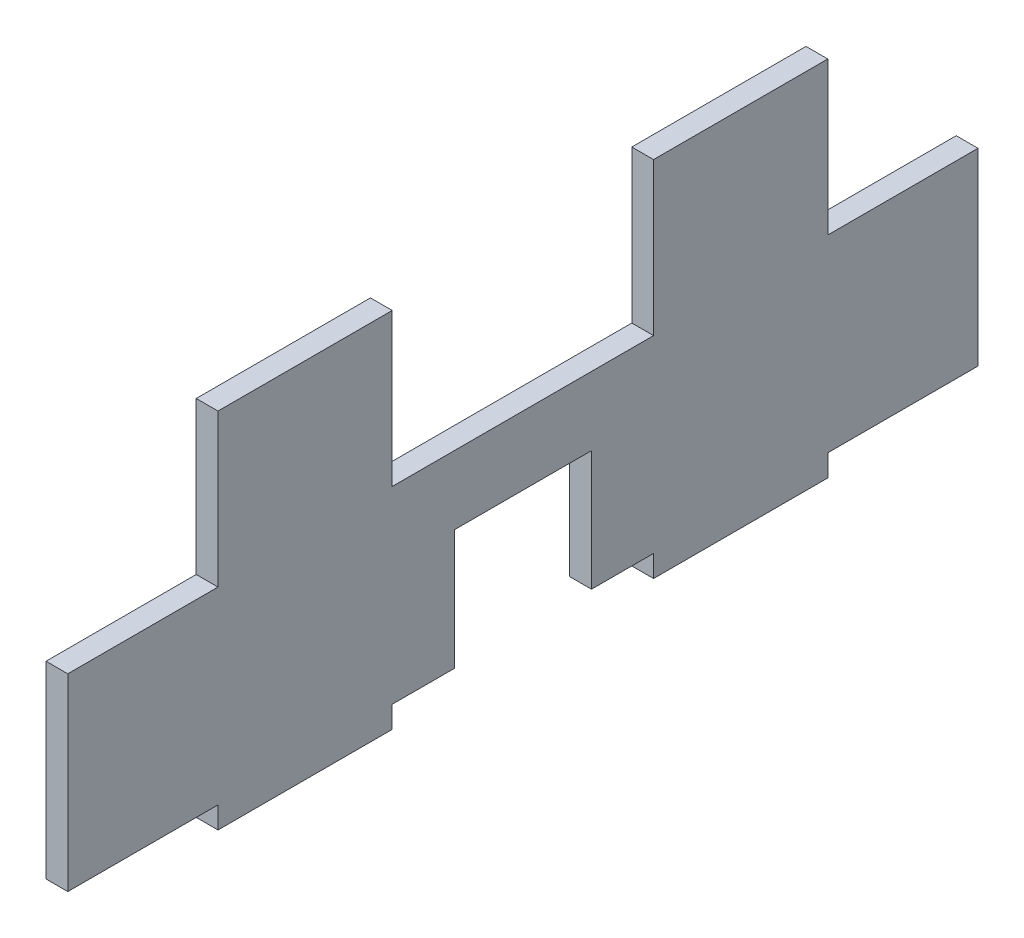
ISO-10303-21;
HEADER;
FILE_DESCRIPTION(('STEP AP214'),'2;1');
FILE_NAME('part.step','',(''),(''),'','','');
FILE_SCHEMA(('AUTOMOTIVE_DESIGN { 1 0 10303 214 1 1 1 1 }'));
ENDSEC;
DATA;
#1=APPLICATION_CONTEXT('core data for automotive mechanical design processes');
#2=APPLICATION_PROTOCOL_DEFINITION('international standard','automotive_design',2000,#1);
#3=PRODUCT_CONTEXT('',#1,'mechanical');
#4=PRODUCT('Part','Part','',(#3));
#5=PRODUCT_RELATED_PRODUCT_CATEGORY('part','',(#4));
#6=PRODUCT_DEFINITION_FORMATION('','',#4);
#7=PRODUCT_DEFINITION_CONTEXT('part definition',#1,'design');
#8=PRODUCT_DEFINITION('design','',#6,#7);
#9=PRODUCT_DEFINITION_SHAPE('','',#8);
#10=(LENGTH_UNIT() NAMED_UNIT(*) SI_UNIT(.MILLI.,.METRE.));
#11=(NAMED_UNIT(*) PLANE_ANGLE_UNIT() SI_UNIT($,.RADIAN.));
#12=(NAMED_UNIT(*) SI_UNIT($,.STERADIAN.) SOLID_ANGLE_UNIT());
#13=UNCERTAINTY_MEASURE_WITH_UNIT(LENGTH_MEASURE(1.E-05),#10,'distance_accuracy_value','');
#14=(GEOMETRIC_REPRESENTATION_CONTEXT(3) GLOBAL_UNCERTAINTY_ASSIGNED_CONTEXT((#13)) GLOBAL_UNIT_ASSIGNED_CONTEXT((#10,
#11,#12)) REPRESENTATION_CONTEXT('',''));
#15=CARTESIAN_POINT('',(0.,0.,0.));
#16=DIRECTION('',(0.,0.,1.));
#17=DIRECTION('',(1.,0.,0.));
#18=AXIS2_PLACEMENT_3D('',#15,#16,#17);
#19=CARTESIAN_POINT('',(6.35,0.,-20.));
#20=DIRECTION('',(0.,0.,1.));
#21=DIRECTION('',(1.,0.,0.));
#22=AXIS2_PLACEMENT_3D('',#19,#20,#21);
#23=PLANE('',#22);
#24=DIRECTION('',(0.,1.,0.));
#25=VECTOR('',#24,1.);
#26=CARTESIAN_POINT('',(0.,0.,-20.));
#27=LINE('',#26,#25);
#28=CARTESIAN_POINT('',(0.,0.,-20.));
#29=VERTEX_POINT('',#28);
#30=CARTESIAN_POINT('',(0.,35.,-20.));
#31=VERTEX_POINT('',#30);
#32=EDGE_CURVE('E430',#29,#31,#27,.T.);
#33=ORIENTED_EDGE('',*,*,#32,.F.);
#34=DIRECTION('',(1.,0.,0.));
#35=VECTOR('',#34,1.);
#36=CARTESIAN_POINT('',(0.,0.,-20.));
#37=LINE('',#36,#35);
#38=CARTESIAN_POINT('',(6.35,0.,-20.));
#39=VERTEX_POINT('',#38);
#40=EDGE_CURVE('E334',#29,#39,#37,.T.);
#41=ORIENTED_EDGE('',*,*,#40,.T.);
#42=DIRECTION('',(0.,1.,0.));
#43=VECTOR('',#42,1.);
#44=CARTESIAN_POINT('',(6.35,0.,-20.));
#45=LINE('',#44,#43);
#46=CARTESIAN_POINT('',(6.35,35.,-20.));
#47=VERTEX_POINT('',#46);
#48=EDGE_CURVE('E431',#39,#47,#45,.T.);
#49=ORIENTED_EDGE('',*,*,#48,.T.);
#50=DIRECTION('',(-1.,0.,0.));
#51=VECTOR('',#50,1.);
#52=CARTESIAN_POINT('',(6.35,35.,-20.));
#53=LINE('',#52,#51);
#54=EDGE_CURVE('E49',#47,#31,#53,.T.);
#55=ORIENTED_EDGE('',*,*,#54,.T.);
#56=EDGE_LOOP('',(#33,#41,#49,#55));
#57=FACE_BOUND('',#56,.T.);
#58=ADVANCED_FACE('F41',(#57),#23,.T.);
#59=CARTESIAN_POINT('',(6.35,0.,132.7));
#60=DIRECTION('',(0.,0.,1.));
#61=DIRECTION('',(1.,0.,0.));
#62=AXIS2_PLACEMENT_3D('',#59,#60,#61);
#63=PLANE('',#62);
#64=DIRECTION('',(1.,0.,0.));
#65=VECTOR('',#64,1.);
#66=CARTESIAN_POINT('',(0.,55.000000012,132.7));
#67=LINE('',#66,#65);
#68=CARTESIAN_POINT('',(0.,55.000000012,132.7));
#69=VERTEX_POINT('',#68);
#70=CARTESIAN_POINT('',(6.35,55.000000012,132.7));
#71=VERTEX_POINT('',#70);
#72=EDGE_CURVE('E286',#69,#71,#67,.T.);
#73=ORIENTED_EDGE('',*,*,#72,.F.);
#74=DIRECTION('',(0.,1.,0.));
#75=VECTOR('',#74,1.);
#76=CARTESIAN_POINT('',(0.,0.,132.7));
#77=LINE('',#76,#75);
#78=CARTESIAN_POINT('',(0.,0.,132.7));
#79=VERTEX_POINT('',#78);
#80=EDGE_CURVE('E448',#79,#69,#77,.T.);
#81=ORIENTED_EDGE('',*,*,#80,.F.);
#82=DIRECTION('',(1.,0.,0.));
#83=VECTOR('',#82,1.);
#84=CARTESIAN_POINT('',(0.,0.,132.7));
#85=LINE('',#84,#83);
#86=CARTESIAN_POINT('',(6.35,0.,132.7));
#87=VERTEX_POINT('',#86);
#88=EDGE_CURVE('E401',#79,#87,#85,.T.);
#89=ORIENTED_EDGE('',*,*,#88,.T.);
#90=DIRECTION('',(0.,1.,0.));
#91=VECTOR('',#90,1.);
#92=CARTESIAN_POINT('',(6.35,0.,132.7));
#93=LINE('',#92,#91);
#94=EDGE_CURVE('E434',#87,#71,#93,.T.);
#95=ORIENTED_EDGE('',*,*,#94,.T.);
#96=EDGE_LOOP('',(#73,#81,#89,#95));
#97=FACE_BOUND('',#96,.T.);
#98=ADVANCED_FACE('F504',(#97),#63,.T.);
#99=CARTESIAN_POINT('',(6.35,0.,20.));
#100=DIRECTION('',(0.,0.,1.));
#101=DIRECTION('',(1.,0.,0.));
#102=AXIS2_PLACEMENT_3D('',#99,#100,#101);
#103=PLANE('',#102);
#104=DIRECTION('',(1.,0.,0.));
#105=VECTOR('',#104,1.);
#106=CARTESIAN_POINT('',(0.,0.,20.));
#107=LINE('',#106,#105);
#108=CARTESIAN_POINT('',(0.,0.,20.));
#109=VERTEX_POINT('',#108);
#110=CARTESIAN_POINT('',(6.35,0.,20.));
#111=VERTEX_POINT('',#110);
#112=EDGE_CURVE('E308',#109,#111,#107,.T.);
#113=ORIENTED_EDGE('',*,*,#112,.F.);
#114=DIRECTION('',(0.,1.,0.));
#115=VECTOR('',#114,1.);
#116=CARTESIAN_POINT('',(0.,0.,20.));
#117=LINE('',#116,#115);
#118=CARTESIAN_POINT('',(0.,35.,20.));
#119=VERTEX_POINT('',#118);
#120=EDGE_CURVE('E452',#109,#119,#117,.T.);
#121=ORIENTED_EDGE('',*,*,#120,.T.);
#122=DIRECTION('',(-1.,0.,0.));
#123=VECTOR('',#122,1.);
#124=CARTESIAN_POINT('',(6.35,35.,20.));
#125=LINE('',#124,#123);
#126=CARTESIAN_POINT('',(6.35,35.,20.));
#127=VERTEX_POINT('',#126);
#128=EDGE_CURVE('E11',#127,#119,#125,.T.);
#129=ORIENTED_EDGE('',*,*,#128,.F.);
#130=DIRECTION('',(0.,1.,0.));
#131=VECTOR('',#130,1.);
#132=CARTESIAN_POINT('',(6.35,0.,20.));
#133=LINE('',#132,#131);
#134=EDGE_CURVE('E439',#111,#127,#133,.T.);
#135=ORIENTED_EDGE('',*,*,#134,.F.);
#136=EDGE_LOOP('',(#113,#121,#129,#135));
#137=FACE_BOUND('',#136,.T.);
#138=ADVANCED_FACE('F483',(#137),#103,.F.);
#139=CARTESIAN_POINT('',(6.35,0.,0.));
#140=DIRECTION('',(1.,0.,0.));
#141=DIRECTION('',(0.,0.,-1.));
#142=AXIS2_PLACEMENT_3D('',#139,#140,#141);
#143=PLANE('',#142);
#144=DIRECTION('',(0.,-1.,0.));
#145=VECTOR('',#144,1.);
#146=CARTESIAN_POINT('',(6.35,0.,38.1));
#147=LINE('',#146,#145);
#148=CARTESIAN_POINT('',(6.35,0.,38.1));
#149=VERTEX_POINT('',#148);
#150=CARTESIAN_POINT('',(6.35,-6.35,38.1));
#151=VERTEX_POINT('',#150);
#152=EDGE_CURVE('E64',#149,#151,#147,.T.);
#153=ORIENTED_EDGE('',*,*,#152,.F.);
#154=DIRECTION('',(0.,0.,-1.));
#155=VECTOR('',#154,1.);
#156=CARTESIAN_POINT('',(6.35,0.,0.));
#157=LINE('',#156,#155);
#158=EDGE_CURVE('E301',#149,#111,#157,.T.);
#159=ORIENTED_EDGE('',*,*,#158,.T.);
#160=ORIENTED_EDGE('',*,*,#134,.T.);
#161=DIRECTION('',(0.,0.,-1.));
#162=VECTOR('',#161,1.);
#163=CARTESIAN_POINT('',(6.35,35.,0.));
#164=LINE('',#163,#162);
#165=EDGE_CURVE('E442',#127,#47,#164,.T.);
#166=ORIENTED_EDGE('',*,*,#165,.T.);
#167=ORIENTED_EDGE('',*,*,#48,.F.);
#168=DIRECTION('',(0.,0.,-1.));
#169=VECTOR('',#168,1.);
#170=CARTESIAN_POINT('',(6.35,0.,0.));
#171=LINE('',#170,#169);
#172=CARTESIAN_POINT('',(6.35,0.,-38.1));
#173=VERTEX_POINT('',#172);
#174=EDGE_CURVE('E320',#39,#173,#171,.T.);
#175=ORIENTED_EDGE('',*,*,#174,.T.);
#176=DIRECTION('',(0.,-1.,0.));
#177=VECTOR('',#176,1.);
#178=CARTESIAN_POINT('',(6.35,0.,-38.1));
#179=LINE('',#178,#177);
#180=CARTESIAN_POINT('',(6.35,-6.35,-38.1));
#181=VERTEX_POINT('',#180);
#182=EDGE_CURVE('E324',#173,#181,#179,.T.);
#183=ORIENTED_EDGE('',*,*,#182,.T.);
#184=DIRECTION('',(0.,0.,1.));
#185=VECTOR('',#184,1.);
#186=CARTESIAN_POINT('',(6.35,-6.35,-257.700000096));
#187=LINE('',#186,#185);
#188=CARTESIAN_POINT('',(6.35,-6.35,-88.9));
#189=VERTEX_POINT('',#188);
#190=EDGE_CURVE('E426',#189,#181,#187,.T.);
#191=ORIENTED_EDGE('',*,*,#190,.F.);
#192=DIRECTION('',(0.,-1.,0.));
#193=VECTOR('',#192,1.);
#194=CARTESIAN_POINT('',(6.35,0.,-88.9));
#195=LINE('',#194,#193);
#196=CARTESIAN_POINT('',(6.35,0.,-88.9));
#197=VERTEX_POINT('',#196);
#198=EDGE_CURVE('E344',#197,#189,#195,.T.);
#199=ORIENTED_EDGE('',*,*,#198,.F.);
#200=DIRECTION('',(0.,0.,-1.));
#201=VECTOR('',#200,1.);
#202=CARTESIAN_POINT('',(6.35,0.,0.));
#203=LINE('',#202,#201);
#204=CARTESIAN_POINT('',(6.35,0.,-132.7));
#205=VERTEX_POINT('',#204);
#206=EDGE_CURVE('E349',#197,#205,#203,.T.);
#207=ORIENTED_EDGE('',*,*,#206,.T.);
#208=DIRECTION('',(0.,-1.,0.));
#209=VECTOR('',#208,1.);
#210=CARTESIAN_POINT('',(6.35,61.350000012,-132.7));
#211=LINE('',#210,#209);
#212=CARTESIAN_POINT('',(6.35,55.000000012,-132.7));
#213=VERTEX_POINT('',#212);
#214=EDGE_CURVE('E400',#213,#205,#211,.T.);
#215=ORIENTED_EDGE('',*,*,#214,.F.);
#216=DIRECTION('',(0.,0.,1.));
#217=VECTOR('',#216,1.);
#218=CARTESIAN_POINT('',(6.35,55.000000012,0.));
#219=LINE('',#218,#217);
#220=CARTESIAN_POINT('',(6.35,55.000000012,-88.9));
#221=VERTEX_POINT('',#220);
#222=EDGE_CURVE('E277',#213,#221,#219,.T.);
#223=ORIENTED_EDGE('',*,*,#222,.T.);
#224=DIRECTION('',(0.,1.,0.));
#225=VECTOR('',#224,1.);
#226=CARTESIAN_POINT('',(6.35,0.,-88.9));
#227=LINE('',#226,#225);
#228=CARTESIAN_POINT('',(6.35,99.450000012,-88.9));
#229=VERTEX_POINT('',#228);
#230=EDGE_CURVE('E368',#221,#229,#227,.T.);
#231=ORIENTED_EDGE('',*,*,#230,.T.);
#232=DIRECTION('',(0.,0.,-1.));
#233=VECTOR('',#232,1.);
#234=CARTESIAN_POINT('',(6.35,99.450000012,-38.1));
#235=LINE('',#234,#233);
#236=CARTESIAN_POINT('',(6.35,99.450000012,-38.1));
#237=VERTEX_POINT('',#236);
#238=EDGE_CURVE('E244',#237,#229,#235,.T.);
#239=ORIENTED_EDGE('',*,*,#238,.F.);
#240=DIRECTION('',(0.,1.,0.));
#241=VECTOR('',#240,1.);
#242=CARTESIAN_POINT('',(6.35,0.,-38.1));
#243=LINE('',#242,#241);
#244=CARTESIAN_POINT('',(6.35,55.000000012,-38.1));
#245=VERTEX_POINT('',#244);
#246=EDGE_CURVE('E260',#245,#237,#243,.T.);
#247=ORIENTED_EDGE('',*,*,#246,.F.);
#248=DIRECTION('',(0.,0.,1.));
#249=VECTOR('',#248,1.);
#250=CARTESIAN_POINT('',(6.35,55.000000012,0.));
#251=LINE('',#250,#249);
#252=CARTESIAN_POINT('',(6.35,55.000000012,38.1));
#253=VERTEX_POINT('',#252);
#254=EDGE_CURVE('E269',#245,#253,#251,.T.);
#255=ORIENTED_EDGE('',*,*,#254,.T.);
#256=DIRECTION('',(0.,1.,0.));
#257=VECTOR('',#256,1.);
#258=CARTESIAN_POINT('',(6.35,0.,38.1));
#259=LINE('',#258,#257);
#260=CARTESIAN_POINT('',(6.35,99.450000012,38.1));
#261=VERTEX_POINT('',#260);
#262=EDGE_CURVE('E222',#253,#261,#259,.T.);
#263=ORIENTED_EDGE('',*,*,#262,.T.);
#264=DIRECTION('',(0.,0.,-1.));
#265=VECTOR('',#264,1.);
#266=CARTESIAN_POINT('',(6.35,99.450000012,88.9));
#267=LINE('',#266,#265);
#268=CARTESIAN_POINT('',(6.35,99.450000012,88.9));
#269=VERTEX_POINT('',#268);
#270=EDGE_CURVE('E218',#269,#261,#267,.T.);
#271=ORIENTED_EDGE('',*,*,#270,.F.);
#272=DIRECTION('',(0.,1.,0.));
#273=VECTOR('',#272,1.);
#274=CARTESIAN_POINT('',(6.35,0.,88.9));
#275=LINE('',#274,#273);
#276=CARTESIAN_POINT('',(6.35,55.000000012,88.9));
#277=VERTEX_POINT('',#276);
#278=EDGE_CURVE('E203',#277,#269,#275,.T.);
#279=ORIENTED_EDGE('',*,*,#278,.F.);
#280=DIRECTION('',(0.,0.,-1.));
#281=VECTOR('',#280,1.);
#282=CARTESIAN_POINT('',(6.35,55.000000012,0.));
#283=LINE('',#282,#281);
#284=EDGE_CURVE('E215',#71,#277,#283,.T.);
#285=ORIENTED_EDGE('',*,*,#284,.F.);
#286=ORIENTED_EDGE('',*,*,#94,.F.);
#287=DIRECTION('',(0.,0.,-1.));
#288=VECTOR('',#287,1.);
#289=CARTESIAN_POINT('',(6.35,0.,0.));
#290=LINE('',#289,#288);
#291=CARTESIAN_POINT('',(6.35,0.,88.9));
#292=VERTEX_POINT('',#291);
#293=EDGE_CURVE('E387',#87,#292,#290,.T.);
#294=ORIENTED_EDGE('',*,*,#293,.T.);
#295=DIRECTION('',(0.,-1.,0.));
#296=VECTOR('',#295,1.);
#297=CARTESIAN_POINT('',(6.35,0.,88.9));
#298=LINE('',#297,#296);
#299=CARTESIAN_POINT('',(6.35,-6.35,88.9));
#300=VERTEX_POINT('',#299);
#301=EDGE_CURVE('E311',#292,#300,#298,.T.);
#302=ORIENTED_EDGE('',*,*,#301,.T.);
#303=DIRECTION('',(0.,0.,1.));
#304=VECTOR('',#303,1.);
#305=CARTESIAN_POINT('',(6.35,-6.35,20.));
#306=LINE('',#305,#304);
#307=EDGE_CURVE('E418',#151,#300,#306,.T.);
#308=ORIENTED_EDGE('',*,*,#307,.F.);
#309=EDGE_LOOP('',(#153,#159,#160,#166,#167,#175,#183,#191,#199,#207,#215,#223,#231,#239,#247,
#255,#263,#271,#279,#285,#286,#294,#302,#308));
#310=FACE_BOUND('',#309,.T.);
#311=ADVANCED_FACE('F219',(#310),#143,.T.);
#312=CARTESIAN_POINT('',(0.,0.,0.));
#313=DIRECTION('',(1.,0.,0.));
#314=DIRECTION('',(0.,0.,-1.));
#315=AXIS2_PLACEMENT_3D('',#312,#313,#314);
#316=PLANE('',#315);
#317=DIRECTION('',(0.,0.,-1.));
#318=VECTOR('',#317,1.);
#319=CARTESIAN_POINT('',(0.,0.,0.));
#320=LINE('',#319,#318);
#321=CARTESIAN_POINT('',(0.,0.,38.1));
#322=VERTEX_POINT('',#321);
#323=EDGE_CURVE('E293',#322,#109,#320,.T.);
#324=ORIENTED_EDGE('',*,*,#323,.F.);
#325=DIRECTION('',(0.,-1.,0.));
#326=VECTOR('',#325,1.);
#327=CARTESIAN_POINT('',(0.,0.,38.1));
#328=LINE('',#327,#326);
#329=CARTESIAN_POINT('',(0.,-6.35,38.1));
#330=VERTEX_POINT('',#329);
#331=EDGE_CURVE('E296',#322,#330,#328,.T.);
#332=ORIENTED_EDGE('',*,*,#331,.T.);
#333=DIRECTION('',(0.,0.,-1.));
#334=VECTOR('',#333,1.);
#335=CARTESIAN_POINT('',(0.,-6.35,132.7));
#336=LINE('',#335,#334);
#337=CARTESIAN_POINT('',(0.,-6.35,88.9));
#338=VERTEX_POINT('',#337);
#339=EDGE_CURVE('E411',#338,#330,#336,.T.);
#340=ORIENTED_EDGE('',*,*,#339,.F.);
#341=DIRECTION('',(0.,-1.,0.));
#342=VECTOR('',#341,1.);
#343=CARTESIAN_POINT('',(0.,0.,88.9));
#344=LINE('',#343,#342);
#345=CARTESIAN_POINT('',(0.,0.,88.9));
#346=VERTEX_POINT('',#345);
#347=EDGE_CURVE('E383',#346,#338,#344,.T.);
#348=ORIENTED_EDGE('',*,*,#347,.F.);
#349=DIRECTION('',(0.,0.,-1.));
#350=VECTOR('',#349,1.);
#351=CARTESIAN_POINT('',(0.,0.,0.));
#352=LINE('',#351,#350);
#353=EDGE_CURVE('E386',#79,#346,#352,.T.);
#354=ORIENTED_EDGE('',*,*,#353,.F.);
#355=ORIENTED_EDGE('',*,*,#80,.T.);
#356=DIRECTION('',(0.,0.,-1.));
#357=VECTOR('',#356,1.);
#358=CARTESIAN_POINT('',(0.,55.000000012,0.));
#359=LINE('',#358,#357);
#360=CARTESIAN_POINT('',(0.,55.000000012,88.9));
#361=VERTEX_POINT('',#360);
#362=EDGE_CURVE('E214',#69,#361,#359,.T.);
#363=ORIENTED_EDGE('',*,*,#362,.T.);
#364=DIRECTION('',(0.,1.,0.));
#365=VECTOR('',#364,1.);
#366=CARTESIAN_POINT('',(0.,0.,88.9));
#367=LINE('',#366,#365);
#368=CARTESIAN_POINT('',(0.,99.450000012,88.9));
#369=VERTEX_POINT('',#368);
#370=EDGE_CURVE('E283',#361,#369,#367,.T.);
#371=ORIENTED_EDGE('',*,*,#370,.T.);
#372=DIRECTION('',(0.,0.,1.));
#373=VECTOR('',#372,1.);
#374=CARTESIAN_POINT('',(0.,99.450000012,38.1));
#375=LINE('',#374,#373);
#376=CARTESIAN_POINT('',(0.,99.450000012,38.1));
#377=VERTEX_POINT('',#376);
#378=EDGE_CURVE('E232',#377,#369,#375,.T.);
#379=ORIENTED_EDGE('',*,*,#378,.F.);
#380=DIRECTION('',(0.,1.,0.));
#381=VECTOR('',#380,1.);
#382=CARTESIAN_POINT('',(0.,0.,38.1));
#383=LINE('',#382,#381);
#384=CARTESIAN_POINT('',(0.,55.000000012,38.1));
#385=VERTEX_POINT('',#384);
#386=EDGE_CURVE('E256',#385,#377,#383,.T.);
#387=ORIENTED_EDGE('',*,*,#386,.F.);
#388=DIRECTION('',(0.,0.,1.));
#389=VECTOR('',#388,1.);
#390=CARTESIAN_POINT('',(0.,55.000000012,0.));
#391=LINE('',#390,#389);
#392=CARTESIAN_POINT('',(0.,55.000000012,-38.1));
#393=VERTEX_POINT('',#392);
#394=EDGE_CURVE('E259',#393,#385,#391,.T.);
#395=ORIENTED_EDGE('',*,*,#394,.F.);
#396=DIRECTION('',(0.,1.,0.));
#397=VECTOR('',#396,1.);
#398=CARTESIAN_POINT('',(0.,0.,-38.1));
#399=LINE('',#398,#397);
#400=CARTESIAN_POINT('',(0.,99.450000012,-38.1));
#401=VERTEX_POINT('',#400);
#402=EDGE_CURVE('E263',#393,#401,#399,.T.);
#403=ORIENTED_EDGE('',*,*,#402,.T.);
#404=DIRECTION('',(0.,0.,1.));
#405=VECTOR('',#404,1.);
#406=CARTESIAN_POINT('',(0.,99.450000012,-88.9));
#407=LINE('',#406,#405);
#408=CARTESIAN_POINT('',(0.,99.450000012,-88.9));
#409=VERTEX_POINT('',#408);
#410=EDGE_CURVE('E252',#409,#401,#407,.T.);
#411=ORIENTED_EDGE('',*,*,#410,.F.);
#412=DIRECTION('',(0.,1.,0.));
#413=VECTOR('',#412,1.);
#414=CARTESIAN_POINT('',(0.,0.,-88.9));
#415=LINE('',#414,#413);
#416=CARTESIAN_POINT('',(0.,55.000000012,-88.9));
#417=VERTEX_POINT('',#416);
#418=EDGE_CURVE('E367',#417,#409,#415,.T.);
#419=ORIENTED_EDGE('',*,*,#418,.F.);
#420=DIRECTION('',(0.,0.,1.));
#421=VECTOR('',#420,1.);
#422=CARTESIAN_POINT('',(0.,55.000000012,0.));
#423=LINE('',#422,#421);
#424=CARTESIAN_POINT('',(0.,55.000000012,-132.7));
#425=VERTEX_POINT('',#424);
#426=EDGE_CURVE('E364',#425,#417,#423,.T.);
#427=ORIENTED_EDGE('',*,*,#426,.F.);
#428=DIRECTION('',(0.,-1.,0.));
#429=VECTOR('',#428,1.);
#430=CARTESIAN_POINT('',(0.,61.350000012,-132.7));
#431=LINE('',#430,#429);
#432=CARTESIAN_POINT('',(0.,0.,-132.7));
#433=VERTEX_POINT('',#432);
#434=EDGE_CURVE('E407',#425,#433,#431,.T.);
#435=ORIENTED_EDGE('',*,*,#434,.T.);
#436=DIRECTION('',(0.,0.,-1.));
#437=VECTOR('',#436,1.);
#438=CARTESIAN_POINT('',(0.,0.,0.));
#439=LINE('',#438,#437);
#440=CARTESIAN_POINT('',(0.,0.,-88.9));
#441=VERTEX_POINT('',#440);
#442=EDGE_CURVE('E340',#441,#433,#439,.T.);
#443=ORIENTED_EDGE('',*,*,#442,.F.);
#444=DIRECTION('',(0.,-1.,0.));
#445=VECTOR('',#444,1.);
#446=CARTESIAN_POINT('',(0.,0.,-88.9));
#447=LINE('',#446,#445);
#448=CARTESIAN_POINT('',(0.,-6.35,-88.9));
#449=VERTEX_POINT('',#448);
#450=EDGE_CURVE('E343',#441,#449,#447,.T.);
#451=ORIENTED_EDGE('',*,*,#450,.T.);
#452=DIRECTION('',(0.,0.,-1.));
#453=VECTOR('',#452,1.);
#454=CARTESIAN_POINT('',(0.,-6.35,-20.));
#455=LINE('',#454,#453);
#456=CARTESIAN_POINT('',(0.,-6.35,-38.1));
#457=VERTEX_POINT('',#456);
#458=EDGE_CURVE('E422',#457,#449,#455,.T.);
#459=ORIENTED_EDGE('',*,*,#458,.F.);
#460=DIRECTION('',(0.,-1.,0.));
#461=VECTOR('',#460,1.);
#462=CARTESIAN_POINT('',(0.,0.,-38.1));
#463=LINE('',#462,#461);
#464=CARTESIAN_POINT('',(0.,0.,-38.1));
#465=VERTEX_POINT('',#464);
#466=EDGE_CURVE('E56',#465,#457,#463,.T.);
#467=ORIENTED_EDGE('',*,*,#466,.F.);
#468=DIRECTION('',(0.,0.,-1.));
#469=VECTOR('',#468,1.);
#470=CARTESIAN_POINT('',(0.,0.,0.));
#471=LINE('',#470,#469);
#472=EDGE_CURVE('E319',#29,#465,#471,.T.);
#473=ORIENTED_EDGE('',*,*,#472,.F.);
#474=ORIENTED_EDGE('',*,*,#32,.T.);
#475=DIRECTION('',(0.,0.,-1.));
#476=VECTOR('',#475,1.);
#477=CARTESIAN_POINT('',(0.,35.,0.));
#478=LINE('',#477,#476);
#479=EDGE_CURVE('E435',#119,#31,#478,.T.);
#480=ORIENTED_EDGE('',*,*,#479,.F.);
#481=ORIENTED_EDGE('',*,*,#120,.F.);
#482=EDGE_LOOP('',(#324,#332,#340,#348,#354,#355,#363,#371,#379,#387,#395,#403,#411,#419,#427,
#435,#443,#451,#459,#467,#473,#474,#480,#481));
#483=FACE_BOUND('',#482,.T.);
#484=ADVANCED_FACE('F471',(#483),#316,.F.);
#485=CARTESIAN_POINT('',(0.,-6.35,0.));
#486=DIRECTION('',(0.,-1.,0.));
#487=DIRECTION('',(0.,0.,-1.));
#488=AXIS2_PLACEMENT_3D('',#485,#486,#487);
#489=PLANE('',#488);
#490=ORIENTED_EDGE('',*,*,#190,.T.);
#491=DIRECTION('',(1.,0.,0.));
#492=VECTOR('',#491,1.);
#493=CARTESIAN_POINT('',(0.,-6.35,-38.1));
#494=LINE('',#493,#492);
#495=EDGE_CURVE('E305',#457,#181,#494,.T.);
#496=ORIENTED_EDGE('',*,*,#495,.F.);
#497=ORIENTED_EDGE('',*,*,#458,.T.);
#498=DIRECTION('',(1.,0.,0.));
#499=VECTOR('',#498,1.);
#500=CARTESIAN_POINT('',(0.,-6.35,-88.9));
#501=LINE('',#500,#499);
#502=EDGE_CURVE('E358',#449,#189,#501,.T.);
#503=ORIENTED_EDGE('',*,*,#502,.T.);
#504=EDGE_LOOP('',(#490,#496,#497,#503));
#505=FACE_BOUND('',#504,.T.);
#506=ADVANCED_FACE('F538',(#505),#489,.T.);
#507=CARTESIAN_POINT('',(0.,-6.35,0.));
#508=DIRECTION('',(0.,-1.,0.));
#509=DIRECTION('',(0.,0.,-1.));
#510=AXIS2_PLACEMENT_3D('',#507,#508,#509);
#511=PLANE('',#510);
#512=DIRECTION('',(1.,0.,0.));
#513=VECTOR('',#512,1.);
#514=CARTESIAN_POINT('',(0.,-6.35,38.1));
#515=LINE('',#514,#513);
#516=EDGE_CURVE('E312',#330,#151,#515,.T.);
#517=ORIENTED_EDGE('',*,*,#516,.T.);
#518=ORIENTED_EDGE('',*,*,#307,.T.);
#519=DIRECTION('',(1.,0.,0.));
#520=VECTOR('',#519,1.);
#521=CARTESIAN_POINT('',(0.,-6.35,88.9));
#522=LINE('',#521,#520);
#523=EDGE_CURVE('E397',#338,#300,#522,.T.);
#524=ORIENTED_EDGE('',*,*,#523,.F.);
#525=ORIENTED_EDGE('',*,*,#339,.T.);
#526=EDGE_LOOP('',(#517,#518,#524,#525));
#527=FACE_BOUND('',#526,.T.);
#528=ADVANCED_FACE('F491',(#527),#511,.T.);
#529=CARTESIAN_POINT('',(0.,61.350000012,-132.7));
#530=DIRECTION('',(0.,0.,1.));
#531=DIRECTION('',(1.,0.,0.));
#532=AXIS2_PLACEMENT_3D('',#529,#530,#531);
#533=PLANE('',#532);
#534=DIRECTION('',(1.,0.,0.));
#535=VECTOR('',#534,1.);
#536=CARTESIAN_POINT('',(0.,0.,-132.7));
#537=LINE('',#536,#535);
#538=EDGE_CURVE('E328',#433,#205,#537,.T.);
#539=ORIENTED_EDGE('',*,*,#538,.F.);
#540=ORIENTED_EDGE('',*,*,#434,.F.);
#541=DIRECTION('',(1.,0.,0.));
#542=VECTOR('',#541,1.);
#543=CARTESIAN_POINT('',(0.,55.000000012,-132.7));
#544=LINE('',#543,#542);
#545=EDGE_CURVE('E371',#425,#213,#544,.T.);
#546=ORIENTED_EDGE('',*,*,#545,.T.);
#547=ORIENTED_EDGE('',*,*,#214,.T.);
#548=EDGE_LOOP('',(#539,#540,#546,#547));
#549=FACE_BOUND('',#548,.T.);
#550=ADVANCED_FACE('F535',(#549),#533,.F.);
#551=CARTESIAN_POINT('',(6.35,35.,0.));
#552=DIRECTION('',(0.,1.,0.));
#553=DIRECTION('',(0.,0.,1.));
#554=AXIS2_PLACEMENT_3D('',#551,#552,#553);
#555=PLANE('',#554);
#556=ORIENTED_EDGE('',*,*,#479,.T.);
#557=ORIENTED_EDGE('',*,*,#54,.F.);
#558=ORIENTED_EDGE('',*,*,#165,.F.);
#559=ORIENTED_EDGE('',*,*,#128,.T.);
#560=EDGE_LOOP('',(#556,#557,#558,#559));
#561=FACE_BOUND('',#560,.T.);
#562=ADVANCED_FACE('F466',(#561),#555,.F.);
#563=CARTESIAN_POINT('',(0.,55.000000012,0.));
#564=DIRECTION('',(0.,1.,0.));
#565=DIRECTION('',(0.,0.,1.));
#566=AXIS2_PLACEMENT_3D('',#563,#564,#565);
#567=PLANE('',#566);
#568=ORIENTED_EDGE('',*,*,#222,.F.);
#569=ORIENTED_EDGE('',*,*,#545,.F.);
#570=ORIENTED_EDGE('',*,*,#426,.T.);
#571=DIRECTION('',(1.,0.,0.));
#572=VECTOR('',#571,1.);
#573=CARTESIAN_POINT('',(0.,55.000000012,-88.9));
#574=LINE('',#573,#572);
#575=EDGE_CURVE('E353',#417,#221,#574,.T.);
#576=ORIENTED_EDGE('',*,*,#575,.T.);
#577=EDGE_LOOP('',(#568,#569,#570,#576));
#578=FACE_BOUND('',#577,.T.);
#579=ADVANCED_FACE('F534',(#578),#567,.T.);
#580=CARTESIAN_POINT('',(0.,0.,-88.9));
#581=DIRECTION('',(0.,0.,-1.));
#582=DIRECTION('',(-1.,0.,0.));
#583=AXIS2_PLACEMENT_3D('',#580,#581,#582);
#584=PLANE('',#583);
#585=ORIENTED_EDGE('',*,*,#230,.F.);
#586=ORIENTED_EDGE('',*,*,#575,.F.);
#587=ORIENTED_EDGE('',*,*,#418,.T.);
#588=DIRECTION('',(-1.,0.,0.));
#589=VECTOR('',#588,1.);
#590=CARTESIAN_POINT('',(6.35,99.450000012,-88.9));
#591=LINE('',#590,#589);
#592=EDGE_CURVE('E248',#229,#409,#591,.T.);
#593=ORIENTED_EDGE('',*,*,#592,.F.);
#594=EDGE_LOOP('',(#585,#586,#587,#593));
#595=FACE_BOUND('',#594,.T.);
#596=ADVANCED_FACE('F556',(#595),#584,.T.);
#597=CARTESIAN_POINT('',(0.,0.,0.));
#598=DIRECTION('',(0.,-1.,0.));
#599=DIRECTION('',(0.,0.,-1.));
#600=AXIS2_PLACEMENT_3D('',#597,#598,#599);
#601=PLANE('',#600);
#602=ORIENTED_EDGE('',*,*,#206,.F.);
#603=DIRECTION('',(1.,0.,0.));
#604=VECTOR('',#603,1.);
#605=CARTESIAN_POINT('',(0.,0.,-88.9));
#606=LINE('',#605,#604);
#607=EDGE_CURVE('E348',#441,#197,#606,.T.);
#608=ORIENTED_EDGE('',*,*,#607,.F.);
#609=ORIENTED_EDGE('',*,*,#442,.T.);
#610=ORIENTED_EDGE('',*,*,#538,.T.);
#611=EDGE_LOOP('',(#602,#608,#609,#610));
#612=FACE_BOUND('',#611,.T.);
#613=ADVANCED_FACE('F560',(#612),#601,.T.);
#614=CARTESIAN_POINT('',(0.,0.,-88.9));
#615=DIRECTION('',(0.,0.,1.));
#616=DIRECTION('',(1.,0.,0.));
#617=AXIS2_PLACEMENT_3D('',#614,#615,#616);
#618=PLANE('',#617);
#619=ORIENTED_EDGE('',*,*,#198,.T.);
#620=ORIENTED_EDGE('',*,*,#502,.F.);
#621=ORIENTED_EDGE('',*,*,#450,.F.);
#622=ORIENTED_EDGE('',*,*,#607,.T.);
#623=EDGE_LOOP('',(#619,#620,#621,#622));
#624=FACE_BOUND('',#623,.T.);
#625=ADVANCED_FACE('F519',(#624),#618,.F.);
#626=CARTESIAN_POINT('',(0.,0.,88.9));
#627=DIRECTION('',(0.,0.,-1.));
#628=DIRECTION('',(-1.,0.,0.));
#629=AXIS2_PLACEMENT_3D('',#626,#627,#628);
#630=PLANE('',#629);
#631=ORIENTED_EDGE('',*,*,#278,.T.);
#632=DIRECTION('',(1.,0.,0.));
#633=VECTOR('',#632,1.);
#634=CARTESIAN_POINT('',(0.,99.450000012,88.9));
#635=LINE('',#634,#633);
#636=EDGE_CURVE('E208',#369,#269,#635,.T.);
#637=ORIENTED_EDGE('',*,*,#636,.F.);
#638=ORIENTED_EDGE('',*,*,#370,.F.);
#639=DIRECTION('',(1.,0.,0.));
#640=VECTOR('',#639,1.);
#641=CARTESIAN_POINT('',(0.,55.000000012,88.9));
#642=LINE('',#641,#640);
#643=EDGE_CURVE('E209',#361,#277,#642,.T.);
#644=ORIENTED_EDGE('',*,*,#643,.T.);
#645=EDGE_LOOP('',(#631,#637,#638,#644));
#646=FACE_BOUND('',#645,.T.);
#647=ADVANCED_FACE('F205',(#646),#630,.F.);
#648=CARTESIAN_POINT('',(0.,55.000000012,0.));
#649=DIRECTION('',(0.,-1.,0.));
#650=DIRECTION('',(0.,0.,-1.));
#651=AXIS2_PLACEMENT_3D('',#648,#649,#650);
#652=PLANE('',#651);
#653=ORIENTED_EDGE('',*,*,#284,.T.);
#654=ORIENTED_EDGE('',*,*,#643,.F.);
#655=ORIENTED_EDGE('',*,*,#362,.F.);
#656=ORIENTED_EDGE('',*,*,#72,.T.);
#657=EDGE_LOOP('',(#653,#654,#655,#656));
#658=FACE_BOUND('',#657,.T.);
#659=ADVANCED_FACE('F506',(#658),#652,.F.);
#660=CARTESIAN_POINT('',(0.,0.,38.1));
#661=DIRECTION('',(0.,0.,-1.));
#662=DIRECTION('',(-1.,0.,0.));
#663=AXIS2_PLACEMENT_3D('',#660,#661,#662);
#664=PLANE('',#663);
#665=ORIENTED_EDGE('',*,*,#262,.F.);
#666=DIRECTION('',(1.,0.,0.));
#667=VECTOR('',#666,1.);
#668=CARTESIAN_POINT('',(0.,55.000000012,38.1));
#669=LINE('',#668,#667);
#670=EDGE_CURVE('E266',#385,#253,#669,.T.);
#671=ORIENTED_EDGE('',*,*,#670,.F.);
#672=ORIENTED_EDGE('',*,*,#386,.T.);
#673=DIRECTION('',(-1.,0.,0.));
#674=VECTOR('',#673,1.);
#675=CARTESIAN_POINT('',(6.35,99.450000012,38.1));
#676=LINE('',#675,#674);
#677=EDGE_CURVE('E227',#261,#377,#676,.T.);
#678=ORIENTED_EDGE('',*,*,#677,.F.);
#679=EDGE_LOOP('',(#665,#671,#672,#678));
#680=FACE_BOUND('',#679,.T.);
#681=ADVANCED_FACE('F508',(#680),#664,.T.);
#682=CARTESIAN_POINT('',(0.,0.,-38.1));
#683=DIRECTION('',(0.,0.,-1.));
#684=DIRECTION('',(-1.,0.,0.));
#685=AXIS2_PLACEMENT_3D('',#682,#683,#684);
#686=PLANE('',#685);
#687=ORIENTED_EDGE('',*,*,#246,.T.);
#688=DIRECTION('',(1.,0.,0.));
#689=VECTOR('',#688,1.);
#690=CARTESIAN_POINT('',(0.,99.450000012,-38.1));
#691=LINE('',#690,#689);
#692=EDGE_CURVE('E240',#401,#237,#691,.T.);
#693=ORIENTED_EDGE('',*,*,#692,.F.);
#694=ORIENTED_EDGE('',*,*,#402,.F.);
#695=DIRECTION('',(1.,0.,0.));
#696=VECTOR('',#695,1.);
#697=CARTESIAN_POINT('',(0.,55.000000012,-38.1));
#698=LINE('',#697,#696);
#699=EDGE_CURVE('E274',#393,#245,#698,.T.);
#700=ORIENTED_EDGE('',*,*,#699,.T.);
#701=EDGE_LOOP('',(#687,#693,#694,#700));
#702=FACE_BOUND('',#701,.T.);
#703=ADVANCED_FACE('F515',(#702),#686,.F.);
#704=CARTESIAN_POINT('',(0.,55.000000012,0.));
#705=DIRECTION('',(0.,1.,0.));
#706=DIRECTION('',(0.,0.,1.));
#707=AXIS2_PLACEMENT_3D('',#704,#705,#706);
#708=PLANE('',#707);
#709=ORIENTED_EDGE('',*,*,#254,.F.);
#710=ORIENTED_EDGE('',*,*,#699,.F.);
#711=ORIENTED_EDGE('',*,*,#394,.T.);
#712=ORIENTED_EDGE('',*,*,#670,.T.);
#713=EDGE_LOOP('',(#709,#710,#711,#712));
#714=FACE_BOUND('',#713,.T.);
#715=ADVANCED_FACE('F551',(#714),#708,.T.);
#716=CARTESIAN_POINT('',(0.,0.,88.9));
#717=DIRECTION('',(0.,0.,1.));
#718=DIRECTION('',(1.,0.,0.));
#719=AXIS2_PLACEMENT_3D('',#716,#717,#718);
#720=PLANE('',#719);
#721=ORIENTED_EDGE('',*,*,#301,.F.);
#722=DIRECTION('',(1.,0.,0.));
#723=VECTOR('',#722,1.);
#724=CARTESIAN_POINT('',(0.,0.,88.9));
#725=LINE('',#724,#723);
#726=EDGE_CURVE('E390',#346,#292,#725,.T.);
#727=ORIENTED_EDGE('',*,*,#726,.F.);
#728=ORIENTED_EDGE('',*,*,#347,.T.);
#729=ORIENTED_EDGE('',*,*,#523,.T.);
#730=EDGE_LOOP('',(#721,#727,#728,#729));
#731=FACE_BOUND('',#730,.T.);
#732=ADVANCED_FACE('F495',(#731),#720,.T.);
#733=CARTESIAN_POINT('',(0.,0.,0.));
#734=DIRECTION('',(0.,-1.,0.));
#735=DIRECTION('',(0.,0.,-1.));
#736=AXIS2_PLACEMENT_3D('',#733,#734,#735);
#737=PLANE('',#736);
#738=ORIENTED_EDGE('',*,*,#293,.F.);
#739=ORIENTED_EDGE('',*,*,#88,.F.);
#740=ORIENTED_EDGE('',*,*,#353,.T.);
#741=ORIENTED_EDGE('',*,*,#726,.T.);
#742=EDGE_LOOP('',(#738,#739,#740,#741));
#743=FACE_BOUND('',#742,.T.);
#744=ADVANCED_FACE('F499',(#743),#737,.T.);
#745=CARTESIAN_POINT('',(0.,0.,0.));
#746=DIRECTION('',(0.,-1.,0.));
#747=DIRECTION('',(0.,0.,-1.));
#748=AXIS2_PLACEMENT_3D('',#745,#746,#747);
#749=PLANE('',#748);
#750=ORIENTED_EDGE('',*,*,#158,.F.);
#751=DIRECTION('',(1.,0.,0.));
#752=VECTOR('',#751,1.);
#753=CARTESIAN_POINT('',(0.,0.,38.1));
#754=LINE('',#753,#752);
#755=EDGE_CURVE('E300',#322,#149,#754,.T.);
#756=ORIENTED_EDGE('',*,*,#755,.F.);
#757=ORIENTED_EDGE('',*,*,#323,.T.);
#758=ORIENTED_EDGE('',*,*,#112,.T.);
#759=EDGE_LOOP('',(#750,#756,#757,#758));
#760=FACE_BOUND('',#759,.T.);
#761=ADVANCED_FACE('F485',(#760),#749,.T.);
#762=CARTESIAN_POINT('',(0.,0.,38.1));
#763=DIRECTION('',(0.,0.,1.));
#764=DIRECTION('',(1.,0.,0.));
#765=AXIS2_PLACEMENT_3D('',#762,#763,#764);
#766=PLANE('',#765);
#767=ORIENTED_EDGE('',*,*,#152,.T.);
#768=ORIENTED_EDGE('',*,*,#516,.F.);
#769=ORIENTED_EDGE('',*,*,#331,.F.);
#770=ORIENTED_EDGE('',*,*,#755,.T.);
#771=EDGE_LOOP('',(#767,#768,#769,#770));
#772=FACE_BOUND('',#771,.T.);
#773=ADVANCED_FACE('F569',(#772),#766,.F.);
#774=CARTESIAN_POINT('',(0.,0.,-38.1));
#775=DIRECTION('',(0.,0.,1.));
#776=DIRECTION('',(1.,0.,0.));
#777=AXIS2_PLACEMENT_3D('',#774,#775,#776);
#778=PLANE('',#777);
#779=ORIENTED_EDGE('',*,*,#182,.F.);
#780=DIRECTION('',(1.,0.,0.));
#781=VECTOR('',#780,1.);
#782=CARTESIAN_POINT('',(0.,0.,-38.1));
#783=LINE('',#782,#781);
#784=EDGE_CURVE('E323',#465,#173,#783,.T.);
#785=ORIENTED_EDGE('',*,*,#784,.F.);
#786=ORIENTED_EDGE('',*,*,#466,.T.);
#787=ORIENTED_EDGE('',*,*,#495,.T.);
#788=EDGE_LOOP('',(#779,#785,#786,#787));
#789=FACE_BOUND('',#788,.T.);
#790=ADVANCED_FACE('F477',(#789),#778,.T.);
#791=CARTESIAN_POINT('',(0.,0.,0.));
#792=DIRECTION('',(0.,-1.,0.));
#793=DIRECTION('',(0.,0.,-1.));
#794=AXIS2_PLACEMENT_3D('',#791,#792,#793);
#795=PLANE('',#794);
#796=ORIENTED_EDGE('',*,*,#174,.F.);
#797=ORIENTED_EDGE('',*,*,#40,.F.);
#798=ORIENTED_EDGE('',*,*,#472,.T.);
#799=ORIENTED_EDGE('',*,*,#784,.T.);
#800=EDGE_LOOP('',(#796,#797,#798,#799));
#801=FACE_BOUND('',#800,.T.);
#802=ADVANCED_FACE('F475',(#801),#795,.T.);
#803=CARTESIAN_POINT('',(0.,99.450000012,0.));
#804=DIRECTION('',(0.,1.,0.));
#805=DIRECTION('',(0.,0.,1.));
#806=AXIS2_PLACEMENT_3D('',#803,#804,#805);
#807=PLANE('',#806);
#808=ORIENTED_EDGE('',*,*,#692,.T.);
#809=ORIENTED_EDGE('',*,*,#238,.T.);
#810=ORIENTED_EDGE('',*,*,#592,.T.);
#811=ORIENTED_EDGE('',*,*,#410,.T.);
#812=EDGE_LOOP('',(#808,#809,#810,#811));
#813=FACE_BOUND('',#812,.T.);
#814=ADVANCED_FACE('F572',(#813),#807,.T.);
#815=CARTESIAN_POINT('',(0.,99.450000012,0.));
#816=DIRECTION('',(0.,1.,0.));
#817=DIRECTION('',(0.,0.,1.));
#818=AXIS2_PLACEMENT_3D('',#815,#816,#817);
#819=PLANE('',#818);
#820=ORIENTED_EDGE('',*,*,#636,.T.);
#821=ORIENTED_EDGE('',*,*,#270,.T.);
#822=ORIENTED_EDGE('',*,*,#677,.T.);
#823=ORIENTED_EDGE('',*,*,#378,.T.);
#824=EDGE_LOOP('',(#820,#821,#822,#823));
#825=FACE_BOUND('',#824,.T.);
#826=ADVANCED_FACE('F230',(#825),#819,.T.);
#827=CLOSED_SHELL('',(#58,#98,#138,#311,#484,#506,#528,#550,#562,#579,#596,#613,#625,#647,#659,
#681,#703,#715,#732,#744,#761,#773,#790,#802,#814,#826));
#828=MANIFOLD_SOLID_BREP('B2',#827);
#829=ADVANCED_BREP_SHAPE_REPRESENTATION('',(#18,#828),#14);
#830=SHAPE_DEFINITION_REPRESENTATION(#9,#829);
ENDSEC;
END-ISO-10303-21;
